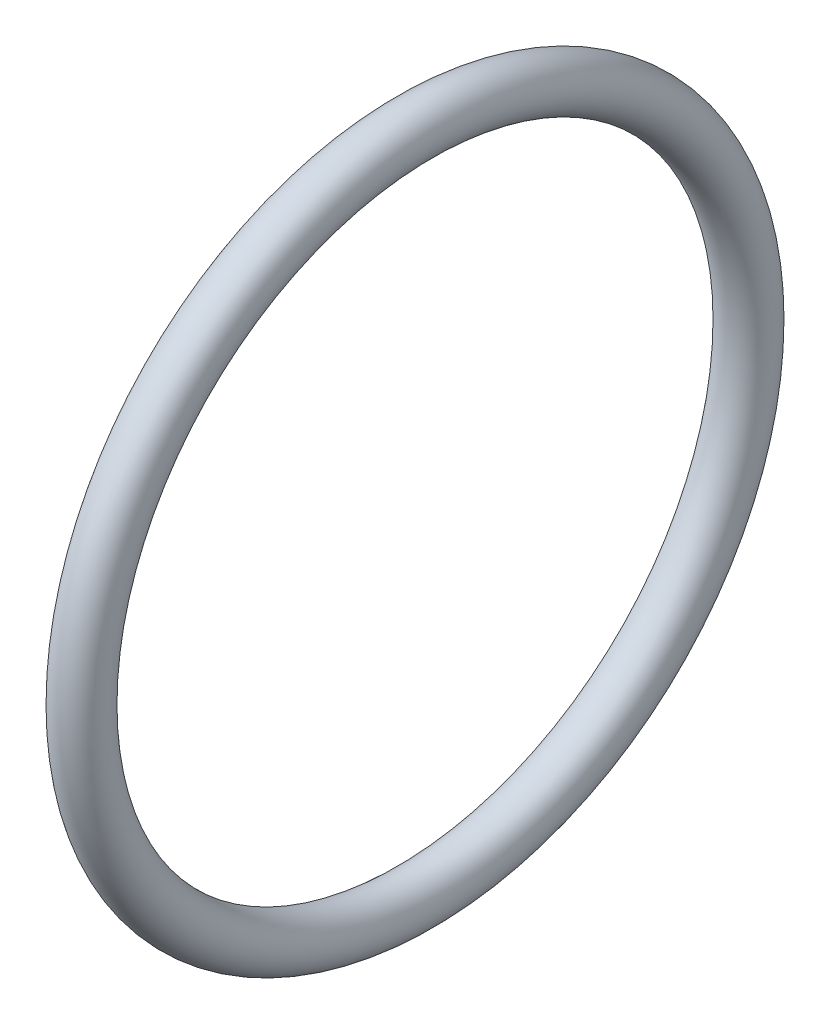
ISO-10303-21;
HEADER;
FILE_DESCRIPTION(('STEP AP214'),'2;1');
FILE_NAME('part.step','',(''),(''),'','','');
FILE_SCHEMA(('AUTOMOTIVE_DESIGN { 1 0 10303 214 1 1 1 1 }'));
ENDSEC;
DATA;
#1=APPLICATION_CONTEXT('core data for automotive mechanical design processes');
#2=APPLICATION_PROTOCOL_DEFINITION('international standard','automotive_design',2000,#1);
#3=PRODUCT_CONTEXT('',#1,'mechanical');
#4=PRODUCT('Part','Part','',(#3));
#5=PRODUCT_RELATED_PRODUCT_CATEGORY('part','',(#4));
#6=PRODUCT_DEFINITION_FORMATION('','',#4);
#7=PRODUCT_DEFINITION_CONTEXT('part definition',#1,'design');
#8=PRODUCT_DEFINITION('design','',#6,#7);
#9=PRODUCT_DEFINITION_SHAPE('','',#8);
#10=(LENGTH_UNIT() NAMED_UNIT(*) SI_UNIT(.MILLI.,.METRE.));
#11=(NAMED_UNIT(*) PLANE_ANGLE_UNIT() SI_UNIT($,.RADIAN.));
#12=(NAMED_UNIT(*) SI_UNIT($,.STERADIAN.) SOLID_ANGLE_UNIT());
#13=UNCERTAINTY_MEASURE_WITH_UNIT(LENGTH_MEASURE(1.E-05),#10,'distance_accuracy_value','');
#14=(GEOMETRIC_REPRESENTATION_CONTEXT(3) GLOBAL_UNCERTAINTY_ASSIGNED_CONTEXT((#13)) GLOBAL_UNIT_ASSIGNED_CONTEXT((#10,
#11,#12)) REPRESENTATION_CONTEXT('',''));
#15=CARTESIAN_POINT('',(0.,0.,0.));
#16=DIRECTION('',(0.,0.,1.));
#17=DIRECTION('',(1.,0.,0.));
#18=AXIS2_PLACEMENT_3D('',#15,#16,#17);
#19=CARTESIAN_POINT('',(0.,0.,0.));
#20=DIRECTION('',(-1.,0.,0.));
#21=DIRECTION('',(0.,0.,1.));
#22=AXIS2_PLACEMENT_3D('',#19,#20,#21);
#23=TOROIDAL_SURFACE('',#22,23.25,1.75);
#24=CARTESIAN_POINT('',(0.,0.,25.));
#25=VERTEX_POINT('',#24);
#26=VERTEX_LOOP('',#25);
#27=FACE_BOUND('',#26,.T.);
#28=ADVANCED_FACE('F28',(#27),#23,.T.);
#29=CLOSED_SHELL('',(#28));
#30=MANIFOLD_SOLID_BREP('B2',#29);
#31=ADVANCED_BREP_SHAPE_REPRESENTATION('',(#18,#30),#14);
#32=SHAPE_DEFINITION_REPRESENTATION(#9,#31);
ENDSEC;
END-ISO-10303-21;
